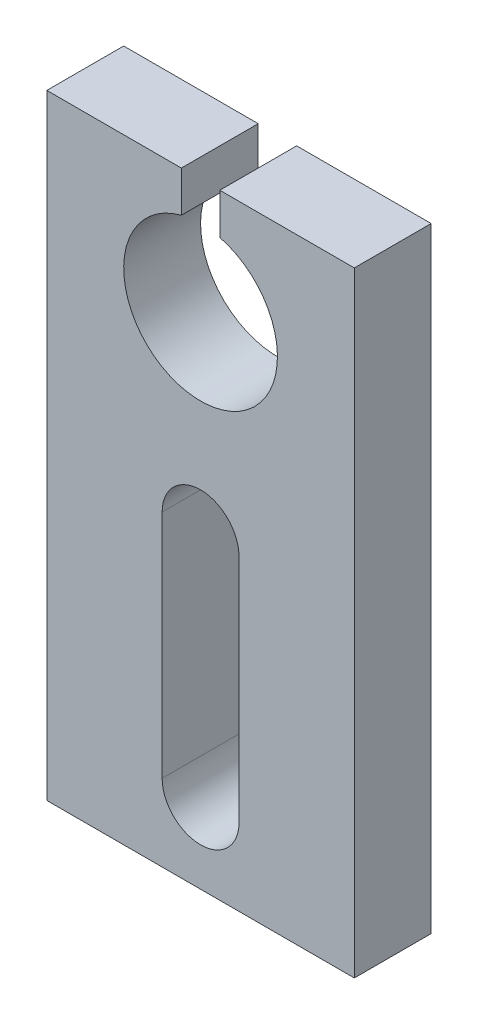
ISO-10303-21;
HEADER;
FILE_DESCRIPTION(('STEP AP214'),'2;1');
FILE_NAME('part.step','',(''),(''),'','','');
FILE_SCHEMA(('AUTOMOTIVE_DESIGN { 1 0 10303 214 1 1 1 1 }'));
ENDSEC;
DATA;
#1=APPLICATION_CONTEXT('core data for automotive mechanical design processes');
#2=APPLICATION_PROTOCOL_DEFINITION('international standard','automotive_design',2000,#1);
#3=PRODUCT_CONTEXT('',#1,'mechanical');
#4=PRODUCT('Part','Part','',(#3));
#5=PRODUCT_RELATED_PRODUCT_CATEGORY('part','',(#4));
#6=PRODUCT_DEFINITION_FORMATION('','',#4);
#7=PRODUCT_DEFINITION_CONTEXT('part definition',#1,'design');
#8=PRODUCT_DEFINITION('design','',#6,#7);
#9=PRODUCT_DEFINITION_SHAPE('','',#8);
#10=(LENGTH_UNIT() NAMED_UNIT(*) SI_UNIT(.MILLI.,.METRE.));
#11=(NAMED_UNIT(*) PLANE_ANGLE_UNIT() SI_UNIT($,.RADIAN.));
#12=(NAMED_UNIT(*) SI_UNIT($,.STERADIAN.) SOLID_ANGLE_UNIT());
#13=UNCERTAINTY_MEASURE_WITH_UNIT(LENGTH_MEASURE(1.E-05),#10,'distance_accuracy_value','');
#14=(GEOMETRIC_REPRESENTATION_CONTEXT(3) GLOBAL_UNCERTAINTY_ASSIGNED_CONTEXT((#13)) GLOBAL_UNIT_ASSIGNED_CONTEXT((#10,
#11,#12)) REPRESENTATION_CONTEXT('',''));
#15=CARTESIAN_POINT('',(0.,0.,0.));
#16=DIRECTION('',(0.,0.,1.));
#17=DIRECTION('',(1.,0.,0.));
#18=AXIS2_PLACEMENT_3D('',#15,#16,#17);
#19=CARTESIAN_POINT('',(-12.7,25.4,6.35));
#20=DIRECTION('',(0.,-1.,0.));
#21=DIRECTION('',(0.,0.,-1.));
#22=AXIS2_PLACEMENT_3D('',#19,#20,#21);
#23=PLANE('',#22);
#24=DIRECTION('',(0.,0.,1.));
#25=VECTOR('',#24,1.);
#26=CARTESIAN_POINT('',(-1.5875,25.4,0.));
#27=LINE('',#26,#25);
#28=CARTESIAN_POINT('',(-1.5875,25.4,0.));
#29=VERTEX_POINT('',#28);
#30=CARTESIAN_POINT('',(-1.5875,25.4,6.35));
#31=VERTEX_POINT('',#30);
#32=EDGE_CURVE('E177',#29,#31,#27,.T.);
#33=ORIENTED_EDGE('',*,*,#32,.F.);
#34=DIRECTION('',(-1.,0.,0.));
#35=VECTOR('',#34,1.);
#36=CARTESIAN_POINT('',(-12.7,25.4,0.));
#37=LINE('',#36,#35);
#38=CARTESIAN_POINT('',(-12.7,25.4,0.));
#39=VERTEX_POINT('',#38);
#40=EDGE_CURVE('E198',#29,#39,#37,.T.);
#41=ORIENTED_EDGE('',*,*,#40,.T.);
#42=DIRECTION('',(0.,0.,-1.));
#43=VECTOR('',#42,1.);
#44=CARTESIAN_POINT('',(-12.7,25.4,6.35));
#45=LINE('',#44,#43);
#46=CARTESIAN_POINT('',(-12.7,25.4,6.35));
#47=VERTEX_POINT('',#46);
#48=EDGE_CURVE('E40',#47,#39,#45,.T.);
#49=ORIENTED_EDGE('',*,*,#48,.F.);
#50=DIRECTION('',(-1.,0.,0.));
#51=VECTOR('',#50,1.);
#52=CARTESIAN_POINT('',(-12.7,25.4,6.35));
#53=LINE('',#52,#51);
#54=EDGE_CURVE('E186',#31,#47,#53,.T.);
#55=ORIENTED_EDGE('',*,*,#54,.F.);
#56=EDGE_LOOP('',(#33,#41,#49,#55));
#57=FACE_BOUND('',#56,.T.);
#58=ADVANCED_FACE('F32',(#57),#23,.F.);
#59=CARTESIAN_POINT('',(0.,0.,6.35));
#60=DIRECTION('',(0.,0.,-1.));
#61=DIRECTION('',(-1.,0.,0.));
#62=AXIS2_PLACEMENT_3D('',#59,#60,#61);
#63=PLANE('',#62);
#64=DIRECTION('',(0.,1.,0.));
#65=VECTOR('',#64,1.);
#66=CARTESIAN_POINT('',(3.175,-19.05,6.35));
#67=LINE('',#66,#65);
#68=CARTESIAN_POINT('',(3.175,-19.05,6.35));
#69=VERTEX_POINT('',#68);
#70=CARTESIAN_POINT('',(3.175,0.,6.35));
#71=VERTEX_POINT('',#70);
#72=EDGE_CURVE('E148',#69,#71,#67,.T.);
#73=ORIENTED_EDGE('',*,*,#72,.F.);
#74=CARTESIAN_POINT('',(0.,-19.05,6.35));
#75=DIRECTION('',(0.,0.,1.));
#76=DIRECTION('',(1.,0.,0.));
#77=AXIS2_PLACEMENT_3D('',#74,#75,#76);
#78=CIRCLE('',#77,3.175);
#79=CARTESIAN_POINT('',(-3.175,-19.05,6.35));
#80=VERTEX_POINT('',#79);
#81=EDGE_CURVE('E47',#80,#69,#78,.T.);
#82=ORIENTED_EDGE('',*,*,#81,.F.);
#83=DIRECTION('',(0.,-1.,0.));
#84=VECTOR('',#83,1.);
#85=CARTESIAN_POINT('',(-3.175,-19.05,6.35));
#86=LINE('',#85,#84);
#87=CARTESIAN_POINT('',(-3.175,0.,6.35));
#88=VERTEX_POINT('',#87);
#89=EDGE_CURVE('E139',#88,#80,#86,.T.);
#90=ORIENTED_EDGE('',*,*,#89,.F.);
#91=CARTESIAN_POINT('',(0.,0.,6.35));
#92=DIRECTION('',(0.,0.,1.));
#93=DIRECTION('',(1.,0.,0.));
#94=AXIS2_PLACEMENT_3D('',#91,#92,#93);
#95=CIRCLE('',#94,3.175);
#96=EDGE_CURVE('E142',#71,#88,#95,.T.);
#97=ORIENTED_EDGE('',*,*,#96,.F.);
#98=EDGE_LOOP('',(#73,#82,#90,#97));
#99=FACE_BOUND('',#98,.T.);
#100=DIRECTION('',(0.,1.,0.));
#101=VECTOR('',#100,1.);
#102=CARTESIAN_POINT('',(-1.5875,0.,6.35));
#103=LINE('',#102,#101);
#104=CARTESIAN_POINT('',(-1.5875,22.0233610621043,6.35));
#105=VERTEX_POINT('',#104);
#106=EDGE_CURVE('E162',#105,#31,#103,.T.);
#107=ORIENTED_EDGE('',*,*,#106,.T.);
#108=ORIENTED_EDGE('',*,*,#54,.T.);
#109=DIRECTION('',(0.,-1.,0.));
#110=VECTOR('',#109,1.);
#111=CARTESIAN_POINT('',(-12.7,-25.4,6.35));
#112=LINE('',#111,#110);
#113=CARTESIAN_POINT('',(-12.7,-25.4,6.35));
#114=VERTEX_POINT('',#113);
#115=EDGE_CURVE('E191',#47,#114,#112,.T.);
#116=ORIENTED_EDGE('',*,*,#115,.T.);
#117=DIRECTION('',(1.,0.,0.));
#118=VECTOR('',#117,1.);
#119=CARTESIAN_POINT('',(-12.7,-25.4,6.35));
#120=LINE('',#119,#118);
#121=CARTESIAN_POINT('',(12.7,-25.4,6.35));
#122=VERTEX_POINT('',#121);
#123=EDGE_CURVE('E193',#114,#122,#120,.T.);
#124=ORIENTED_EDGE('',*,*,#123,.T.);
#125=DIRECTION('',(0.,1.,0.));
#126=VECTOR('',#125,1.);
#127=CARTESIAN_POINT('',(12.7,-25.4,6.35));
#128=LINE('',#127,#126);
#129=CARTESIAN_POINT('',(12.7,25.4,6.35));
#130=VERTEX_POINT('',#129);
#131=EDGE_CURVE('E183',#122,#130,#128,.T.);
#132=ORIENTED_EDGE('',*,*,#131,.T.);
#133=CARTESIAN_POINT('',(1.5875,25.4,6.35));
#134=VERTEX_POINT('',#133);
#135=EDGE_CURVE('E188',#130,#134,#53,.T.);
#136=ORIENTED_EDGE('',*,*,#135,.T.);
#137=DIRECTION('',(0.,1.,0.));
#138=VECTOR('',#137,1.);
#139=CARTESIAN_POINT('',(1.5875,0.,6.35));
#140=LINE('',#139,#138);
#141=CARTESIAN_POINT('',(1.5875,22.0233610621043,6.35));
#142=VERTEX_POINT('',#141);
#143=EDGE_CURVE('E170',#142,#134,#140,.T.);
#144=ORIENTED_EDGE('',*,*,#143,.F.);
#145=CARTESIAN_POINT('',(0.,15.875,6.35));
#146=DIRECTION('',(0.,0.,1.));
#147=DIRECTION('',(1.,0.,0.));
#148=AXIS2_PLACEMENT_3D('',#145,#146,#147);
#149=CIRCLE('',#148,6.35);
#150=EDGE_CURVE('E154',#105,#142,#149,.T.);
#151=ORIENTED_EDGE('',*,*,#150,.F.);
#152=EDGE_LOOP('',(#107,#108,#116,#124,#132,#136,#144,#151));
#153=FACE_BOUND('',#152,.T.);
#154=ADVANCED_FACE('F230',(#99,#153),#63,.F.);
#155=CARTESIAN_POINT('',(0.,0.,0.));
#156=DIRECTION('',(0.,0.,-1.));
#157=DIRECTION('',(-1.,0.,0.));
#158=AXIS2_PLACEMENT_3D('',#155,#156,#157);
#159=PLANE('',#158);
#160=CARTESIAN_POINT('',(0.,-19.05,0.));
#161=DIRECTION('',(0.,0.,1.));
#162=DIRECTION('',(1.,0.,0.));
#163=AXIS2_PLACEMENT_3D('',#160,#161,#162);
#164=CIRCLE('',#163,3.175);
#165=CARTESIAN_POINT('',(-3.175,-19.05,0.));
#166=VERTEX_POINT('',#165);
#167=CARTESIAN_POINT('',(3.175,-19.05,0.));
#168=VERTEX_POINT('',#167);
#169=EDGE_CURVE('E123',#166,#168,#164,.T.);
#170=ORIENTED_EDGE('',*,*,#169,.T.);
#171=DIRECTION('',(0.,1.,0.));
#172=VECTOR('',#171,1.);
#173=CARTESIAN_POINT('',(3.175,-19.05,0.));
#174=LINE('',#173,#172);
#175=CARTESIAN_POINT('',(3.175,0.,0.));
#176=VERTEX_POINT('',#175);
#177=EDGE_CURVE('E132',#168,#176,#174,.T.);
#178=ORIENTED_EDGE('',*,*,#177,.T.);
#179=CARTESIAN_POINT('',(0.,0.,0.));
#180=DIRECTION('',(0.,0.,1.));
#181=DIRECTION('',(1.,0.,0.));
#182=AXIS2_PLACEMENT_3D('',#179,#180,#181);
#183=CIRCLE('',#182,3.175);
#184=CARTESIAN_POINT('',(-3.175,0.,0.));
#185=VERTEX_POINT('',#184);
#186=EDGE_CURVE('E55',#176,#185,#183,.T.);
#187=ORIENTED_EDGE('',*,*,#186,.T.);
#188=DIRECTION('',(0.,-1.,0.));
#189=VECTOR('',#188,1.);
#190=CARTESIAN_POINT('',(-3.175,-19.05,0.));
#191=LINE('',#190,#189);
#192=EDGE_CURVE('E129',#185,#166,#191,.T.);
#193=ORIENTED_EDGE('',*,*,#192,.T.);
#194=EDGE_LOOP('',(#170,#178,#187,#193));
#195=FACE_BOUND('',#194,.T.);
#196=ORIENTED_EDGE('',*,*,#40,.F.);
#197=DIRECTION('',(0.,1.,0.));
#198=VECTOR('',#197,1.);
#199=CARTESIAN_POINT('',(-1.5875,0.,0.));
#200=LINE('',#199,#198);
#201=CARTESIAN_POINT('',(-1.5875,22.0233610621043,0.));
#202=VERTEX_POINT('',#201);
#203=EDGE_CURVE('E165',#202,#29,#200,.T.);
#204=ORIENTED_EDGE('',*,*,#203,.F.);
#205=CARTESIAN_POINT('',(0.,15.875,0.));
#206=DIRECTION('',(0.,0.,1.));
#207=DIRECTION('',(1.,0.,0.));
#208=AXIS2_PLACEMENT_3D('',#205,#206,#207);
#209=CIRCLE('',#208,6.35);
#210=CARTESIAN_POINT('',(1.5875,22.0233610621043,0.));
#211=VERTEX_POINT('',#210);
#212=EDGE_CURVE('E158',#202,#211,#209,.T.);
#213=ORIENTED_EDGE('',*,*,#212,.T.);
#214=DIRECTION('',(0.,1.,0.));
#215=VECTOR('',#214,1.);
#216=CARTESIAN_POINT('',(1.5875,0.,0.));
#217=LINE('',#216,#215);
#218=CARTESIAN_POINT('',(1.5875,25.4,0.));
#219=VERTEX_POINT('',#218);
#220=EDGE_CURVE('E161',#211,#219,#217,.T.);
#221=ORIENTED_EDGE('',*,*,#220,.T.);
#222=CARTESIAN_POINT('',(12.7,25.4,0.));
#223=VERTEX_POINT('',#222);
#224=EDGE_CURVE('E199',#223,#219,#37,.T.);
#225=ORIENTED_EDGE('',*,*,#224,.F.);
#226=DIRECTION('',(0.,1.,0.));
#227=VECTOR('',#226,1.);
#228=CARTESIAN_POINT('',(12.7,-25.4,0.));
#229=LINE('',#228,#227);
#230=CARTESIAN_POINT('',(12.7,-25.4,0.));
#231=VERTEX_POINT('',#230);
#232=EDGE_CURVE('E176',#231,#223,#229,.T.);
#233=ORIENTED_EDGE('',*,*,#232,.F.);
#234=DIRECTION('',(1.,0.,0.));
#235=VECTOR('',#234,1.);
#236=CARTESIAN_POINT('',(-12.7,-25.4,0.));
#237=LINE('',#236,#235);
#238=CARTESIAN_POINT('',(-12.7,-25.4,0.));
#239=VERTEX_POINT('',#238);
#240=EDGE_CURVE('E187',#239,#231,#237,.T.);
#241=ORIENTED_EDGE('',*,*,#240,.F.);
#242=DIRECTION('',(0.,-1.,0.));
#243=VECTOR('',#242,1.);
#244=CARTESIAN_POINT('',(-12.7,-25.4,0.));
#245=LINE('',#244,#243);
#246=EDGE_CURVE('E202',#39,#239,#245,.T.);
#247=ORIENTED_EDGE('',*,*,#246,.F.);
#248=EDGE_LOOP('',(#196,#204,#213,#221,#225,#233,#241,#247));
#249=FACE_BOUND('',#248,.T.);
#250=ADVANCED_FACE('F136',(#195,#249),#159,.T.);
#251=CARTESIAN_POINT('',(12.7,-25.4,6.35));
#252=DIRECTION('',(-1.,0.,0.));
#253=DIRECTION('',(0.,0.,1.));
#254=AXIS2_PLACEMENT_3D('',#251,#252,#253);
#255=PLANE('',#254);
#256=ORIENTED_EDGE('',*,*,#232,.T.);
#257=DIRECTION('',(0.,0.,-1.));
#258=VECTOR('',#257,1.);
#259=CARTESIAN_POINT('',(12.7,25.4,6.35));
#260=LINE('',#259,#258);
#261=EDGE_CURVE('E11',#130,#223,#260,.T.);
#262=ORIENTED_EDGE('',*,*,#261,.F.);
#263=ORIENTED_EDGE('',*,*,#131,.F.);
#264=DIRECTION('',(0.,0.,-1.));
#265=VECTOR('',#264,1.);
#266=CARTESIAN_POINT('',(12.7,-25.4,6.35));
#267=LINE('',#266,#265);
#268=EDGE_CURVE('E195',#122,#231,#267,.T.);
#269=ORIENTED_EDGE('',*,*,#268,.T.);
#270=EDGE_LOOP('',(#256,#262,#263,#269));
#271=FACE_BOUND('',#270,.T.);
#272=ADVANCED_FACE('F34',(#271),#255,.F.);
#273=ORIENTED_EDGE('',*,*,#224,.T.);
#274=DIRECTION('',(0.,0.,1.));
#275=VECTOR('',#274,1.);
#276=CARTESIAN_POINT('',(1.5875,25.4,0.));
#277=LINE('',#276,#275);
#278=EDGE_CURVE('E179',#219,#134,#277,.T.);
#279=ORIENTED_EDGE('',*,*,#278,.T.);
#280=ORIENTED_EDGE('',*,*,#135,.F.);
#281=ORIENTED_EDGE('',*,*,#261,.T.);
#282=EDGE_LOOP('',(#273,#279,#280,#281));
#283=FACE_BOUND('',#282,.T.);
#284=ADVANCED_FACE('F244',(#283),#23,.F.);
#285=CARTESIAN_POINT('',(-12.7,-25.4,6.35));
#286=DIRECTION('',(1.,0.,0.));
#287=DIRECTION('',(0.,0.,-1.));
#288=AXIS2_PLACEMENT_3D('',#285,#286,#287);
#289=PLANE('',#288);
#290=ORIENTED_EDGE('',*,*,#246,.T.);
#291=DIRECTION('',(0.,0.,-1.));
#292=VECTOR('',#291,1.);
#293=CARTESIAN_POINT('',(-12.7,-25.4,6.35));
#294=LINE('',#293,#292);
#295=EDGE_CURVE('E207',#114,#239,#294,.T.);
#296=ORIENTED_EDGE('',*,*,#295,.F.);
#297=ORIENTED_EDGE('',*,*,#115,.F.);
#298=ORIENTED_EDGE('',*,*,#48,.T.);
#299=EDGE_LOOP('',(#290,#296,#297,#298));
#300=FACE_BOUND('',#299,.T.);
#301=ADVANCED_FACE('F214',(#300),#289,.F.);
#302=CARTESIAN_POINT('',(-12.7,-25.4,6.35));
#303=DIRECTION('',(0.,1.,0.));
#304=DIRECTION('',(0.,0.,1.));
#305=AXIS2_PLACEMENT_3D('',#302,#303,#304);
#306=PLANE('',#305);
#307=ORIENTED_EDGE('',*,*,#240,.T.);
#308=ORIENTED_EDGE('',*,*,#268,.F.);
#309=ORIENTED_EDGE('',*,*,#123,.F.);
#310=ORIENTED_EDGE('',*,*,#295,.T.);
#311=EDGE_LOOP('',(#307,#308,#309,#310));
#312=FACE_BOUND('',#311,.T.);
#313=ADVANCED_FACE('F224',(#312),#306,.F.);
#314=CARTESIAN_POINT('',(0.,15.875,0.));
#315=DIRECTION('',(0.,0.,1.));
#316=DIRECTION('',(1.,0.,0.));
#317=AXIS2_PLACEMENT_3D('',#314,#315,#316);
#318=CYLINDRICAL_SURFACE('',#317,6.35);
#319=ORIENTED_EDGE('',*,*,#150,.T.);
#320=DIRECTION('',(0.,0.,1.));
#321=VECTOR('',#320,1.);
#322=CARTESIAN_POINT('',(1.5875,22.0233610621043,0.));
#323=LINE('',#322,#321);
#324=EDGE_CURVE('E167',#211,#142,#323,.T.);
#325=ORIENTED_EDGE('',*,*,#324,.F.);
#326=ORIENTED_EDGE('',*,*,#212,.F.);
#327=DIRECTION('',(0.,0.,1.));
#328=VECTOR('',#327,1.);
#329=CARTESIAN_POINT('',(-1.5875,22.0233610621043,0.));
#330=LINE('',#329,#328);
#331=EDGE_CURVE('E174',#202,#105,#330,.T.);
#332=ORIENTED_EDGE('',*,*,#331,.T.);
#333=EDGE_LOOP('',(#319,#325,#326,#332));
#334=FACE_BOUND('',#333,.T.);
#335=ADVANCED_FACE('F240',(#334),#318,.F.);
#336=CARTESIAN_POINT('',(-1.5875,0.,0.));
#337=DIRECTION('',(1.,0.,0.));
#338=DIRECTION('',(0.,0.,-1.));
#339=AXIS2_PLACEMENT_3D('',#336,#337,#338);
#340=PLANE('',#339);
#341=ORIENTED_EDGE('',*,*,#106,.F.);
#342=ORIENTED_EDGE('',*,*,#331,.F.);
#343=ORIENTED_EDGE('',*,*,#203,.T.);
#344=ORIENTED_EDGE('',*,*,#32,.T.);
#345=EDGE_LOOP('',(#341,#342,#343,#344));
#346=FACE_BOUND('',#345,.T.);
#347=ADVANCED_FACE('F236',(#346),#340,.T.);
#348=CARTESIAN_POINT('',(1.5875,0.,0.));
#349=DIRECTION('',(1.,0.,0.));
#350=DIRECTION('',(0.,1.,0.));
#351=AXIS2_PLACEMENT_3D('',#348,#349,#350);
#352=PLANE('',#351);
#353=ORIENTED_EDGE('',*,*,#143,.T.);
#354=ORIENTED_EDGE('',*,*,#278,.F.);
#355=ORIENTED_EDGE('',*,*,#220,.F.);
#356=ORIENTED_EDGE('',*,*,#324,.T.);
#357=EDGE_LOOP('',(#353,#354,#355,#356));
#358=FACE_BOUND('',#357,.T.);
#359=ADVANCED_FACE('F242',(#358),#352,.F.);
#360=CARTESIAN_POINT('',(0.,-19.05,0.));
#361=DIRECTION('',(0.,0.,1.));
#362=DIRECTION('',(1.,0.,0.));
#363=AXIS2_PLACEMENT_3D('',#360,#361,#362);
#364=CYLINDRICAL_SURFACE('',#363,3.175);
#365=ORIENTED_EDGE('',*,*,#81,.T.);
#366=DIRECTION('',(0.,0.,1.));
#367=VECTOR('',#366,1.);
#368=CARTESIAN_POINT('',(3.175,-19.05,0.));
#369=LINE('',#368,#367);
#370=EDGE_CURVE('E119',#168,#69,#369,.T.);
#371=ORIENTED_EDGE('',*,*,#370,.F.);
#372=ORIENTED_EDGE('',*,*,#169,.F.);
#373=DIRECTION('',(0.,0.,1.));
#374=VECTOR('',#373,1.);
#375=CARTESIAN_POINT('',(-3.175,-19.05,0.));
#376=LINE('',#375,#374);
#377=EDGE_CURVE('E152',#166,#80,#376,.T.);
#378=ORIENTED_EDGE('',*,*,#377,.T.);
#379=EDGE_LOOP('',(#365,#371,#372,#378));
#380=FACE_BOUND('',#379,.T.);
#381=ADVANCED_FACE('F121',(#380),#364,.F.);
#382=CARTESIAN_POINT('',(-3.175,-19.05,0.));
#383=DIRECTION('',(-1.,0.,0.));
#384=DIRECTION('',(0.,0.,1.));
#385=AXIS2_PLACEMENT_3D('',#382,#383,#384);
#386=PLANE('',#385);
#387=ORIENTED_EDGE('',*,*,#89,.T.);
#388=ORIENTED_EDGE('',*,*,#377,.F.);
#389=ORIENTED_EDGE('',*,*,#192,.F.);
#390=DIRECTION('',(0.,0.,1.));
#391=VECTOR('',#390,1.);
#392=CARTESIAN_POINT('',(-3.175,0.,0.));
#393=LINE('',#392,#391);
#394=EDGE_CURVE('E155',#185,#88,#393,.T.);
#395=ORIENTED_EDGE('',*,*,#394,.T.);
#396=EDGE_LOOP('',(#387,#388,#389,#395));
#397=FACE_BOUND('',#396,.T.);
#398=ADVANCED_FACE('F278',(#397),#386,.F.);
#399=CARTESIAN_POINT('',(0.,0.,0.));
#400=DIRECTION('',(0.,0.,1.));
#401=DIRECTION('',(1.,0.,0.));
#402=AXIS2_PLACEMENT_3D('',#399,#400,#401);
#403=CYLINDRICAL_SURFACE('',#402,3.175);
#404=ORIENTED_EDGE('',*,*,#96,.T.);
#405=ORIENTED_EDGE('',*,*,#394,.F.);
#406=ORIENTED_EDGE('',*,*,#186,.F.);
#407=DIRECTION('',(0.,0.,1.));
#408=VECTOR('',#407,1.);
#409=CARTESIAN_POINT('',(3.175,0.,0.));
#410=LINE('',#409,#408);
#411=EDGE_CURVE('E128',#176,#71,#410,.T.);
#412=ORIENTED_EDGE('',*,*,#411,.T.);
#413=EDGE_LOOP('',(#404,#405,#406,#412));
#414=FACE_BOUND('',#413,.T.);
#415=ADVANCED_FACE('F281',(#414),#403,.F.);
#416=CARTESIAN_POINT('',(3.175,-19.05,0.));
#417=DIRECTION('',(1.,0.,0.));
#418=DIRECTION('',(0.,0.,-1.));
#419=AXIS2_PLACEMENT_3D('',#416,#417,#418);
#420=PLANE('',#419);
#421=ORIENTED_EDGE('',*,*,#72,.T.);
#422=ORIENTED_EDGE('',*,*,#411,.F.);
#423=ORIENTED_EDGE('',*,*,#177,.F.);
#424=ORIENTED_EDGE('',*,*,#370,.T.);
#425=EDGE_LOOP('',(#421,#422,#423,#424));
#426=FACE_BOUND('',#425,.T.);
#427=ADVANCED_FACE('F133',(#426),#420,.F.);
#428=CLOSED_SHELL('',(#58,#154,#250,#272,#284,#301,#313,#335,#347,#359,#381,#398,#415,#427));
#429=MANIFOLD_SOLID_BREP('B2',#428);
#430=ADVANCED_BREP_SHAPE_REPRESENTATION('',(#18,#429),#14);
#431=SHAPE_DEFINITION_REPRESENTATION(#9,#430);
ENDSEC;
END-ISO-10303-21;
